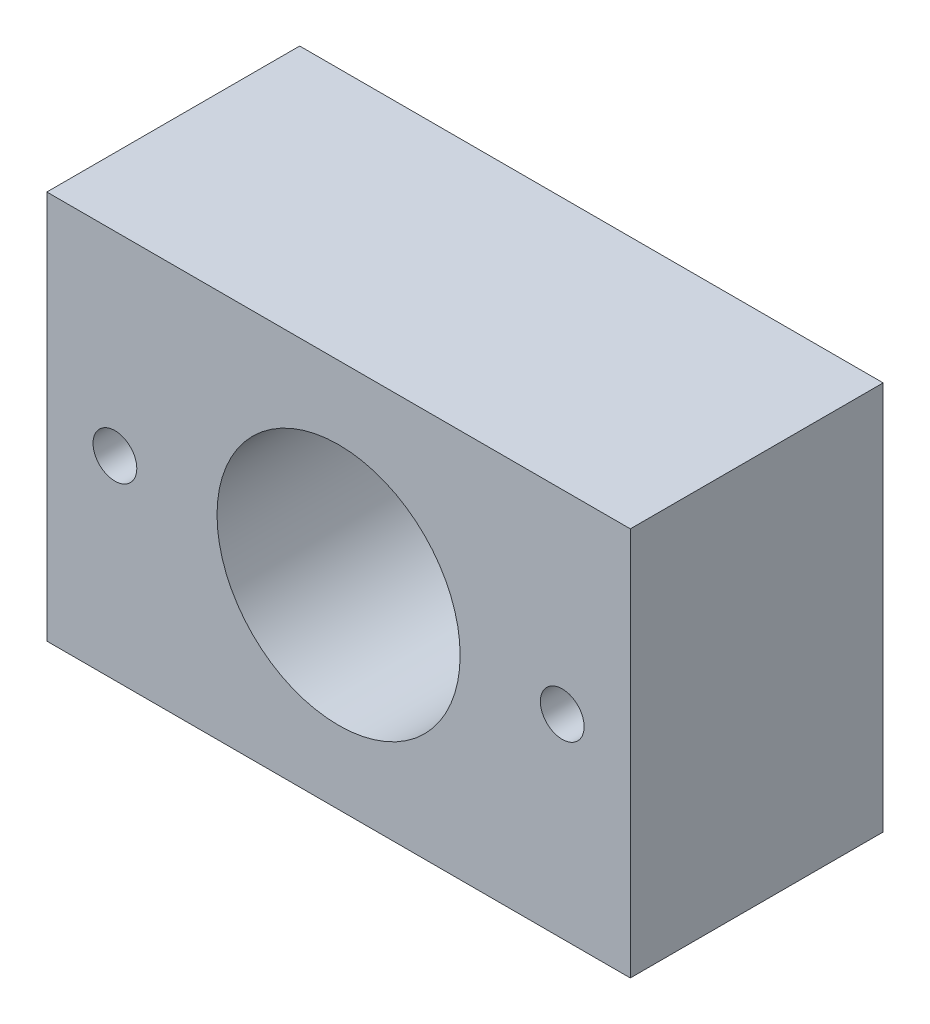
ISO-10303-21;
HEADER;
FILE_DESCRIPTION(('STEP AP214'),'2;1');
FILE_NAME('part.step','',(''),(''),'','','');
FILE_SCHEMA(('AUTOMOTIVE_DESIGN { 1 0 10303 214 1 1 1 1 }'));
ENDSEC;
DATA;
#1=APPLICATION_CONTEXT('core data for automotive mechanical design processes');
#2=APPLICATION_PROTOCOL_DEFINITION('international standard','automotive_design',2000,#1);
#3=PRODUCT_CONTEXT('',#1,'mechanical');
#4=PRODUCT('Part','Part','',(#3));
#5=PRODUCT_RELATED_PRODUCT_CATEGORY('part','',(#4));
#6=PRODUCT_DEFINITION_FORMATION('','',#4);
#7=PRODUCT_DEFINITION_CONTEXT('part definition',#1,'design');
#8=PRODUCT_DEFINITION('design','',#6,#7);
#9=PRODUCT_DEFINITION_SHAPE('','',#8);
#10=(LENGTH_UNIT() NAMED_UNIT(*) SI_UNIT(.MILLI.,.METRE.));
#11=(NAMED_UNIT(*) PLANE_ANGLE_UNIT() SI_UNIT($,.RADIAN.));
#12=(NAMED_UNIT(*) SI_UNIT($,.STERADIAN.) SOLID_ANGLE_UNIT());
#13=UNCERTAINTY_MEASURE_WITH_UNIT(LENGTH_MEASURE(1.E-05),#10,'distance_accuracy_value','');
#14=(GEOMETRIC_REPRESENTATION_CONTEXT(3) GLOBAL_UNCERTAINTY_ASSIGNED_CONTEXT((#13)) GLOBAL_UNIT_ASSIGNED_CONTEXT((#10,
#11,#12)) REPRESENTATION_CONTEXT('',''));
#15=CARTESIAN_POINT('',(0.,0.,0.));
#16=DIRECTION('',(0.,0.,1.));
#17=DIRECTION('',(1.,0.,0.));
#18=AXIS2_PLACEMENT_3D('',#15,#16,#17);
#19=CARTESIAN_POINT('',(23.,0.,-1.));
#20=DIRECTION('',(0.,0.,1.));
#21=DIRECTION('',(1.,0.,0.));
#22=AXIS2_PLACEMENT_3D('',#19,#20,#21);
#23=CYLINDRICAL_SURFACE('',#22,2.25);
#24=CARTESIAN_POINT('',(23.,0.,26.));
#25=DIRECTION('',(0.,0.,1.));
#26=DIRECTION('',(1.,0.,0.));
#27=AXIS2_PLACEMENT_3D('',#24,#25,#26);
#28=CIRCLE('',#27,2.25);
#29=CARTESIAN_POINT('',(25.25,0.,26.));
#30=VERTEX_POINT('',#29);
#31=EDGE_CURVE('E106',#30,#30,#28,.T.);
#32=ORIENTED_EDGE('',*,*,#31,.T.);
#33=EDGE_LOOP('',(#32));
#34=FACE_BOUND('',#33,.T.);
#35=CARTESIAN_POINT('',(23.,0.,0.));
#36=DIRECTION('',(0.,0.,1.));
#37=DIRECTION('',(1.,0.,0.));
#38=AXIS2_PLACEMENT_3D('',#35,#36,#37);
#39=CIRCLE('',#38,2.25);
#40=CARTESIAN_POINT('',(25.25,0.,0.));
#41=VERTEX_POINT('',#40);
#42=EDGE_CURVE('E10',#41,#41,#39,.T.);
#43=ORIENTED_EDGE('',*,*,#42,.F.);
#44=EDGE_LOOP('',(#43));
#45=FACE_BOUND('',#44,.T.);
#46=ADVANCED_FACE('F16',(#34,#45),#23,.F.);
#47=CARTESIAN_POINT('',(0.,0.,-1.));
#48=DIRECTION('',(0.,0.,1.));
#49=DIRECTION('',(1.,0.,0.));
#50=AXIS2_PLACEMENT_3D('',#47,#48,#49);
#51=CYLINDRICAL_SURFACE('',#50,12.5);
#52=CARTESIAN_POINT('',(0.,0.,26.));
#53=DIRECTION('',(0.,0.,1.));
#54=DIRECTION('',(1.,0.,0.));
#55=AXIS2_PLACEMENT_3D('',#52,#53,#54);
#56=CIRCLE('',#55,12.5);
#57=CARTESIAN_POINT('',(12.5,0.,26.));
#58=VERTEX_POINT('',#57);
#59=EDGE_CURVE('E102',#58,#58,#56,.T.);
#60=ORIENTED_EDGE('',*,*,#59,.T.);
#61=EDGE_LOOP('',(#60));
#62=FACE_BOUND('',#61,.T.);
#63=CARTESIAN_POINT('',(0.,0.,0.));
#64=DIRECTION('',(0.,0.,1.));
#65=DIRECTION('',(1.,0.,0.));
#66=AXIS2_PLACEMENT_3D('',#63,#64,#65);
#67=CIRCLE('',#66,12.5);
#68=CARTESIAN_POINT('',(12.5,0.,0.));
#69=VERTEX_POINT('',#68);
#70=EDGE_CURVE('E26',#69,#69,#67,.T.);
#71=ORIENTED_EDGE('',*,*,#70,.F.);
#72=EDGE_LOOP('',(#71));
#73=FACE_BOUND('',#72,.T.);
#74=ADVANCED_FACE('F18',(#62,#73),#51,.F.);
#75=CARTESIAN_POINT('',(-23.,0.,-1.));
#76=DIRECTION('',(0.,0.,1.));
#77=DIRECTION('',(1.,0.,0.));
#78=AXIS2_PLACEMENT_3D('',#75,#76,#77);
#79=CYLINDRICAL_SURFACE('',#78,2.25);
#80=CARTESIAN_POINT('',(-23.,0.,26.));
#81=DIRECTION('',(0.,0.,1.));
#82=DIRECTION('',(1.,0.,0.));
#83=AXIS2_PLACEMENT_3D('',#80,#81,#82);
#84=CIRCLE('',#83,2.25);
#85=CARTESIAN_POINT('',(-20.75,0.,26.));
#86=VERTEX_POINT('',#85);
#87=EDGE_CURVE('E107',#86,#86,#84,.T.);
#88=ORIENTED_EDGE('',*,*,#87,.T.);
#89=EDGE_LOOP('',(#88));
#90=FACE_BOUND('',#89,.T.);
#91=CARTESIAN_POINT('',(-23.,0.,0.));
#92=DIRECTION('',(0.,0.,1.));
#93=DIRECTION('',(1.,0.,0.));
#94=AXIS2_PLACEMENT_3D('',#91,#92,#93);
#95=CIRCLE('',#94,2.25);
#96=CARTESIAN_POINT('',(-20.75,0.,0.));
#97=VERTEX_POINT('',#96);
#98=EDGE_CURVE('E127',#97,#97,#95,.T.);
#99=ORIENTED_EDGE('',*,*,#98,.F.);
#100=EDGE_LOOP('',(#99));
#101=FACE_BOUND('',#100,.T.);
#102=ADVANCED_FACE('F141',(#90,#101),#79,.F.);
#103=CARTESIAN_POINT('',(30.,-20.,0.));
#104=DIRECTION('',(1.,0.,0.));
#105=DIRECTION('',(0.,1.,0.));
#106=AXIS2_PLACEMENT_3D('',#103,#104,#105);
#107=PLANE('',#106);
#108=DIRECTION('',(0.,0.,1.));
#109=VECTOR('',#108,1.);
#110=CARTESIAN_POINT('',(30.,-20.,0.));
#111=LINE('',#110,#109);
#112=CARTESIAN_POINT('',(30.,-20.,0.));
#113=VERTEX_POINT('',#112);
#114=CARTESIAN_POINT('',(30.,-20.,26.));
#115=VERTEX_POINT('',#114);
#116=EDGE_CURVE('E68',#113,#115,#111,.T.);
#117=ORIENTED_EDGE('',*,*,#116,.F.);
#118=DIRECTION('',(0.,1.,0.));
#119=VECTOR('',#118,1.);
#120=CARTESIAN_POINT('',(30.,-20.,0.));
#121=LINE('',#120,#119);
#122=CARTESIAN_POINT('',(30.,20.,0.));
#123=VERTEX_POINT('',#122);
#124=EDGE_CURVE('E38',#113,#123,#121,.T.);
#125=ORIENTED_EDGE('',*,*,#124,.T.);
#126=DIRECTION('',(0.,0.,1.));
#127=VECTOR('',#126,1.);
#128=CARTESIAN_POINT('',(30.,20.,0.));
#129=LINE('',#128,#127);
#130=CARTESIAN_POINT('',(30.,20.,26.));
#131=VERTEX_POINT('',#130);
#132=EDGE_CURVE('E69',#123,#131,#129,.T.);
#133=ORIENTED_EDGE('',*,*,#132,.T.);
#134=DIRECTION('',(0.,1.,0.));
#135=VECTOR('',#134,1.);
#136=CARTESIAN_POINT('',(30.,-20.,26.));
#137=LINE('',#136,#135);
#138=EDGE_CURVE('E64',#115,#131,#137,.T.);
#139=ORIENTED_EDGE('',*,*,#138,.F.);
#140=EDGE_LOOP('',(#117,#125,#133,#139));
#141=FACE_BOUND('',#140,.T.);
#142=ADVANCED_FACE('F66',(#141),#107,.T.);
#143=CARTESIAN_POINT('',(-30.,-20.,0.));
#144=DIRECTION('',(0.,0.,1.));
#145=DIRECTION('',(1.,0.,0.));
#146=AXIS2_PLACEMENT_3D('',#143,#144,#145);
#147=PLANE('',#146);
#148=ORIENTED_EDGE('',*,*,#42,.T.);
#149=EDGE_LOOP('',(#148));
#150=FACE_BOUND('',#149,.T.);
#151=ORIENTED_EDGE('',*,*,#70,.T.);
#152=EDGE_LOOP('',(#151));
#153=FACE_BOUND('',#152,.T.);
#154=ORIENTED_EDGE('',*,*,#98,.T.);
#155=EDGE_LOOP('',(#154));
#156=FACE_BOUND('',#155,.T.);
#157=DIRECTION('',(1.,0.,0.));
#158=VECTOR('',#157,1.);
#159=CARTESIAN_POINT('',(-30.,20.,0.));
#160=LINE('',#159,#158);
#161=CARTESIAN_POINT('',(-30.,20.,0.));
#162=VERTEX_POINT('',#161);
#163=EDGE_CURVE('E114',#162,#123,#160,.T.);
#164=ORIENTED_EDGE('',*,*,#163,.T.);
#165=ORIENTED_EDGE('',*,*,#124,.F.);
#166=DIRECTION('',(1.,0.,0.));
#167=VECTOR('',#166,1.);
#168=CARTESIAN_POINT('',(-30.,-20.,0.));
#169=LINE('',#168,#167);
#170=CARTESIAN_POINT('',(-30.,-20.,0.));
#171=VERTEX_POINT('',#170);
#172=EDGE_CURVE('E74',#171,#113,#169,.T.);
#173=ORIENTED_EDGE('',*,*,#172,.F.);
#174=DIRECTION('',(0.,1.,0.));
#175=VECTOR('',#174,1.);
#176=CARTESIAN_POINT('',(-30.,-20.,0.));
#177=LINE('',#176,#175);
#178=EDGE_CURVE('E94',#171,#162,#177,.T.);
#179=ORIENTED_EDGE('',*,*,#178,.T.);
#180=EDGE_LOOP('',(#164,#165,#173,#179));
#181=FACE_BOUND('',#180,.T.);
#182=ADVANCED_FACE('F137',(#150,#153,#156,#181),#147,.F.);
#183=CARTESIAN_POINT('',(-30.,20.,0.));
#184=DIRECTION('',(0.,1.,0.));
#185=DIRECTION('',(1.,0.,0.));
#186=AXIS2_PLACEMENT_3D('',#183,#184,#185);
#187=PLANE('',#186);
#188=ORIENTED_EDGE('',*,*,#163,.F.);
#189=DIRECTION('',(0.,0.,1.));
#190=VECTOR('',#189,1.);
#191=CARTESIAN_POINT('',(-30.,20.,0.));
#192=LINE('',#191,#190);
#193=CARTESIAN_POINT('',(-30.,20.,26.));
#194=VERTEX_POINT('',#193);
#195=EDGE_CURVE('E98',#162,#194,#192,.T.);
#196=ORIENTED_EDGE('',*,*,#195,.T.);
#197=DIRECTION('',(1.,0.,0.));
#198=VECTOR('',#197,1.);
#199=CARTESIAN_POINT('',(-30.,20.,26.));
#200=LINE('',#199,#198);
#201=EDGE_CURVE('E73',#194,#131,#200,.T.);
#202=ORIENTED_EDGE('',*,*,#201,.T.);
#203=ORIENTED_EDGE('',*,*,#132,.F.);
#204=EDGE_LOOP('',(#188,#196,#202,#203));
#205=FACE_BOUND('',#204,.T.);
#206=ADVANCED_FACE('F156',(#205),#187,.T.);
#207=CARTESIAN_POINT('',(-30.,-20.,26.));
#208=DIRECTION('',(0.,0.,1.));
#209=DIRECTION('',(1.,0.,0.));
#210=AXIS2_PLACEMENT_3D('',#207,#208,#209);
#211=PLANE('',#210);
#212=ORIENTED_EDGE('',*,*,#31,.F.);
#213=EDGE_LOOP('',(#212));
#214=FACE_BOUND('',#213,.T.);
#215=ORIENTED_EDGE('',*,*,#59,.F.);
#216=EDGE_LOOP('',(#215));
#217=FACE_BOUND('',#216,.T.);
#218=ORIENTED_EDGE('',*,*,#87,.F.);
#219=EDGE_LOOP('',(#218));
#220=FACE_BOUND('',#219,.T.);
#221=DIRECTION('',(0.,1.,0.));
#222=VECTOR('',#221,1.);
#223=CARTESIAN_POINT('',(-30.,-20.,26.));
#224=LINE('',#223,#222);
#225=CARTESIAN_POINT('',(-30.,-20.,26.));
#226=VERTEX_POINT('',#225);
#227=EDGE_CURVE('E80',#226,#194,#224,.T.);
#228=ORIENTED_EDGE('',*,*,#227,.F.);
#229=DIRECTION('',(1.,0.,0.));
#230=VECTOR('',#229,1.);
#231=CARTESIAN_POINT('',(-30.,-20.,26.));
#232=LINE('',#231,#230);
#233=EDGE_CURVE('E77',#226,#115,#232,.T.);
#234=ORIENTED_EDGE('',*,*,#233,.T.);
#235=ORIENTED_EDGE('',*,*,#138,.T.);
#236=ORIENTED_EDGE('',*,*,#201,.F.);
#237=EDGE_LOOP('',(#228,#234,#235,#236));
#238=FACE_BOUND('',#237,.T.);
#239=ADVANCED_FACE('F78',(#214,#217,#220,#238),#211,.T.);
#240=CARTESIAN_POINT('',(-30.,-20.,0.));
#241=DIRECTION('',(0.,1.,0.));
#242=DIRECTION('',(1.,0.,0.));
#243=AXIS2_PLACEMENT_3D('',#240,#241,#242);
#244=PLANE('',#243);
#245=ORIENTED_EDGE('',*,*,#116,.T.);
#246=ORIENTED_EDGE('',*,*,#233,.F.);
#247=DIRECTION('',(0.,0.,1.));
#248=VECTOR('',#247,1.);
#249=CARTESIAN_POINT('',(-30.,-20.,0.));
#250=LINE('',#249,#248);
#251=EDGE_CURVE('E89',#171,#226,#250,.T.);
#252=ORIENTED_EDGE('',*,*,#251,.F.);
#253=ORIENTED_EDGE('',*,*,#172,.T.);
#254=EDGE_LOOP('',(#245,#246,#252,#253));
#255=FACE_BOUND('',#254,.T.);
#256=ADVANCED_FACE('F87',(#255),#244,.F.);
#257=CARTESIAN_POINT('',(-30.,-20.,0.));
#258=DIRECTION('',(1.,0.,0.));
#259=DIRECTION('',(0.,1.,0.));
#260=AXIS2_PLACEMENT_3D('',#257,#258,#259);
#261=PLANE('',#260);
#262=ORIENTED_EDGE('',*,*,#227,.T.);
#263=ORIENTED_EDGE('',*,*,#195,.F.);
#264=ORIENTED_EDGE('',*,*,#178,.F.);
#265=ORIENTED_EDGE('',*,*,#251,.T.);
#266=EDGE_LOOP('',(#262,#263,#264,#265));
#267=FACE_BOUND('',#266,.T.);
#268=ADVANCED_FACE('F170',(#267),#261,.F.);
#269=CLOSED_SHELL('',(#46,#74,#102,#142,#182,#206,#239,#256,#268));
#270=MANIFOLD_SOLID_BREP('B1',#269);
#271=ADVANCED_BREP_SHAPE_REPRESENTATION('',(#18,#270),#14);
#272=SHAPE_DEFINITION_REPRESENTATION(#9,#271);
ENDSEC;
END-ISO-10303-21;
